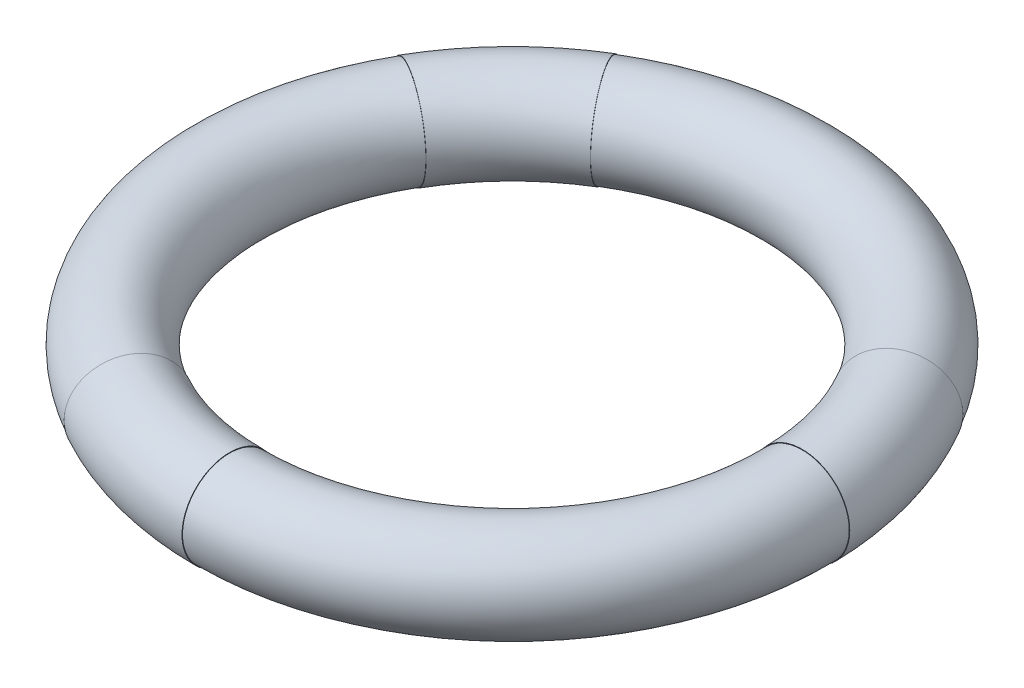
ISO-10303-21;
HEADER;
FILE_DESCRIPTION(('STEP AP214'),'2;1');
FILE_NAME('part.step','',(''),(''),'','','');
FILE_SCHEMA(('AUTOMOTIVE_DESIGN { 1 0 10303 214 1 1 1 1 }'));
ENDSEC;
DATA;
#1=APPLICATION_CONTEXT('core data for automotive mechanical design processes');
#2=APPLICATION_PROTOCOL_DEFINITION('international standard','automotive_design',2000,#1);
#3=PRODUCT_CONTEXT('',#1,'mechanical');
#4=PRODUCT('Part','Part','',(#3));
#5=PRODUCT_RELATED_PRODUCT_CATEGORY('part','',(#4));
#6=PRODUCT_DEFINITION_FORMATION('','',#4);
#7=PRODUCT_DEFINITION_CONTEXT('part definition',#1,'design');
#8=PRODUCT_DEFINITION('design','',#6,#7);
#9=PRODUCT_DEFINITION_SHAPE('','',#8);
#10=(LENGTH_UNIT() NAMED_UNIT(*) SI_UNIT(.MILLI.,.METRE.));
#11=(NAMED_UNIT(*) PLANE_ANGLE_UNIT() SI_UNIT($,.RADIAN.));
#12=(NAMED_UNIT(*) SI_UNIT($,.STERADIAN.) SOLID_ANGLE_UNIT());
#13=UNCERTAINTY_MEASURE_WITH_UNIT(LENGTH_MEASURE(1.E-05),#10,'distance_accuracy_value','');
#14=(GEOMETRIC_REPRESENTATION_CONTEXT(3) GLOBAL_UNCERTAINTY_ASSIGNED_CONTEXT((#13)) GLOBAL_UNIT_ASSIGNED_CONTEXT((#10,
#11,#12)) REPRESENTATION_CONTEXT('',''));
#15=CARTESIAN_POINT('',(0.,0.,0.));
#16=DIRECTION('',(0.,0.,1.));
#17=DIRECTION('',(1.,0.,0.));
#18=AXIS2_PLACEMENT_3D('',#15,#16,#17);
#19=CARTESIAN_POINT('',(0.,0.,0.));
#20=DIRECTION('',(0.,-1.,0.));
#21=DIRECTION('',(0.,0.,-1.));
#22=AXIS2_PLACEMENT_3D('',#19,#20,#21);
#23=TOROIDAL_SURFACE('',#22,152.4,25.4);
#24=CARTESIAN_POINT('',(152.357566020971,0.,-3.59611959833303));
#25=DIRECTION('',(-0.0235965852908991,0.,-0.999721561817394));
#26=DIRECTION('',(-0.999721561817394,0.,0.0235965852908991));
#27=AXIS2_PLACEMENT_3D('',#24,#25,#26);
#28=CIRCLE('',#27,25.4);
#29=CARTESIAN_POINT('',(177.750493691133,0.,-4.19547286472187));
#30=VERTEX_POINT('',#29);
#31=EDGE_CURVE('E10',#30,#30,#28,.T.);
#32=CARTESIAN_POINT('',(0.,0.,152.4));
#33=DIRECTION('',(1.,0.,0.));
#34=DIRECTION('',(0.,0.,-1.));
#35=AXIS2_PLACEMENT_3D('',#32,#33,#34);
#36=CIRCLE('',#35,25.4);
#37=CARTESIAN_POINT('',(0.,0.,177.8));
#38=VERTEX_POINT('',#37);
#39=EDGE_CURVE('E73',#38,#38,#36,.T.);
#40=CARTESIAN_POINT('',(0.,0.,0.));
#41=DIRECTION('',(0.,-1.,0.));
#42=DIRECTION('',(0.,0.,-1.));
#43=AXIS2_PLACEMENT_3D('',#40,#41,#42);
#44=CIRCLE('',#43,177.8);
#45=EDGE_CURVE('',#30,#38,#44,.T.);
#46=ORIENTED_EDGE('',*,*,#31,.F.);
#47=ORIENTED_EDGE('',*,*,#39,.T.);
#48=ORIENTED_EDGE('',*,*,#45,.T.);
#49=ORIENTED_EDGE('',*,*,#45,.F.);
#50=EDGE_LOOP('',(#46,#48,#47,#49));
#51=FACE_BOUND('',#50,.T.);
#52=ADVANCED_FACE('F45',(#51),#23,.T.);
#53=CARTESIAN_POINT('',(-79.2931139376895,0.,-130.147462833759));
#54=DIRECTION('',(-0.853985976599466,0.,0.520296023213186));
#55=DIRECTION('',(0.520296023213186,0.,0.853985976599466));
#56=AXIS2_PLACEMENT_3D('',#53,#54,#55);
#57=CIRCLE('',#56,25.4);
#58=CARTESIAN_POINT('',(-92.5086329273044,0.,-151.838706639385));
#59=VERTEX_POINT('',#58);
#60=EDGE_CURVE('E53',#59,#59,#57,.T.);
#61=CARTESIAN_POINT('',(131.982271536749,0.,-76.1999999999988));
#62=DIRECTION('',(-0.499999999999992,0.,-0.866025403784443));
#63=DIRECTION('',(-0.866025403784443,0.,0.499999999999992));
#64=AXIS2_PLACEMENT_3D('',#61,#62,#63);
#65=CIRCLE('',#64,25.4);
#66=CARTESIAN_POINT('',(153.979316792874,0.,-88.8999999999986));
#67=VERTEX_POINT('',#66);
#68=EDGE_CURVE('E97',#67,#67,#65,.T.);
#69=CARTESIAN_POINT('',(0.,0.,0.));
#70=DIRECTION('',(0.,-1.,0.));
#71=DIRECTION('',(0.,0.,-1.));
#72=AXIS2_PLACEMENT_3D('',#69,#70,#71);
#73=CIRCLE('',#72,177.8);
#74=EDGE_CURVE('',#59,#67,#73,.T.);
#75=ORIENTED_EDGE('',*,*,#60,.F.);
#76=ORIENTED_EDGE('',*,*,#68,.T.);
#77=ORIENTED_EDGE('',*,*,#74,.T.);
#78=ORIENTED_EDGE('',*,*,#74,.F.);
#79=EDGE_LOOP('',(#75,#77,#76,#78));
#80=FACE_BOUND('',#79,.T.);
#81=ADVANCED_FACE('F102',(#80),#23,.T.);
#82=CARTESIAN_POINT('',(0.,0.,0.));
#83=DIRECTION('',(0.,1.,0.));
#84=DIRECTION('',(0.,0.,1.));
#85=AXIS2_PLACEMENT_3D('',#82,#83,#84);
#86=TOROIDAL_SURFACE('',#85,152.4,25.6794);
#87=CARTESIAN_POINT('',(-73.0644520832807,0.,133.743582432093));
#88=DIRECTION('',(0.877582561890372,0.,0.479425538604204));
#89=DIRECTION('',(0.479425538604204,0.,-0.877582561890372));
#90=AXIS2_PLACEMENT_3D('',#87,#88,#89);
#91=CIRCLE('',#90,25.6794);
#92=CARTESIAN_POINT('',(-85.3758122593135,0.,156.2793760719));
#93=VERTEX_POINT('',#92);
#94=EDGE_CURVE('E63',#93,#93,#91,.T.);
#95=CARTESIAN_POINT('',(0.,0.,152.4));
#96=DIRECTION('',(1.,0.,0.));
#97=DIRECTION('',(0.,0.,-1.));
#98=AXIS2_PLACEMENT_3D('',#95,#96,#97);
#99=CIRCLE('',#98,25.6794);
#100=CARTESIAN_POINT('',(0.,0.,178.0794));
#101=VERTEX_POINT('',#100);
#102=EDGE_CURVE('E69',#101,#101,#99,.T.);
#103=CARTESIAN_POINT('',(0.,0.,0.));
#104=DIRECTION('',(0.,1.,0.));
#105=DIRECTION('',(0.,0.,1.));
#106=AXIS2_PLACEMENT_3D('',#103,#104,#105);
#107=CIRCLE('',#106,178.0794);
#108=EDGE_CURVE('',#93,#101,#107,.T.);
#109=ORIENTED_EDGE('',*,*,#94,.T.);
#110=ORIENTED_EDGE('',*,*,#102,.F.);
#111=ORIENTED_EDGE('',*,*,#108,.T.);
#112=ORIENTED_EDGE('',*,*,#108,.F.);
#113=EDGE_LOOP('',(#109,#111,#110,#112));
#114=FACE_BOUND('',#113,.T.);
#115=ADVANCED_FACE('F130',(#114),#86,.T.);
#116=CARTESIAN_POINT('',(-73.0644520832807,0.,133.743582432093));
#117=DIRECTION('',(0.877582561890372,0.,0.479425538604204));
#118=DIRECTION('',(0.479425538604204,0.,-0.877582561890372));
#119=AXIS2_PLACEMENT_3D('',#116,#117,#118);
#120=PLANE('',#119);
#121=CARTESIAN_POINT('',(-73.0644520832807,0.,133.743582432093));
#122=DIRECTION('',(0.877582561890372,0.,0.479425538604204));
#123=DIRECTION('',(0.479425538604204,0.,-0.877582561890372));
#124=AXIS2_PLACEMENT_3D('',#121,#122,#123);
#125=CIRCLE('',#124,25.4);
#126=CARTESIAN_POINT('',(-85.2418607638275,0.,156.034179504108));
#127=VERTEX_POINT('',#126);
#128=EDGE_CURVE('E58',#127,#127,#125,.T.);
#129=ORIENTED_EDGE('',*,*,#128,.T.);
#130=EDGE_LOOP('',(#129));
#131=FACE_BOUND('',#130,.T.);
#132=ORIENTED_EDGE('',*,*,#94,.F.);
#133=EDGE_LOOP('',(#132));
#134=FACE_BOUND('',#133,.T.);
#135=ADVANCED_FACE('F142',(#131,#134),#120,.F.);
#136=CARTESIAN_POINT('',(0.,0.,152.4));
#137=DIRECTION('',(1.,0.,0.));
#138=DIRECTION('',(0.,0.,-1.));
#139=AXIS2_PLACEMENT_3D('',#136,#137,#138);
#140=PLANE('',#139);
#141=ORIENTED_EDGE('',*,*,#39,.F.);
#142=EDGE_LOOP('',(#141));
#143=FACE_BOUND('',#142,.T.);
#144=ORIENTED_EDGE('',*,*,#102,.T.);
#145=EDGE_LOOP('',(#144));
#146=FACE_BOUND('',#145,.T.);
#147=ADVANCED_FACE('F134',(#143,#146),#140,.T.);
#148=CARTESIAN_POINT('',(-131.982271536748,0.,-76.2000000000006));
#149=DIRECTION('',(-0.500000000000004,0.,0.866025403784436));
#150=DIRECTION('',(0.866025403784436,0.,0.500000000000004));
#151=AXIS2_PLACEMENT_3D('',#148,#149,#150);
#152=CIRCLE('',#151,25.4);
#153=CARTESIAN_POINT('',(-153.979316792873,0.,-88.9000000000007));
#154=VERTEX_POINT('',#153);
#155=EDGE_CURVE('E85',#154,#154,#152,.T.);
#156=CARTESIAN_POINT('',(0.,0.,0.));
#157=DIRECTION('',(0.,-1.,0.));
#158=DIRECTION('',(0.,0.,-1.));
#159=AXIS2_PLACEMENT_3D('',#156,#157,#158);
#160=CIRCLE('',#159,177.8);
#161=EDGE_CURVE('',#127,#154,#160,.T.);
#162=ORIENTED_EDGE('',*,*,#128,.F.);
#163=ORIENTED_EDGE('',*,*,#155,.T.);
#164=ORIENTED_EDGE('',*,*,#161,.T.);
#165=ORIENTED_EDGE('',*,*,#161,.F.);
#166=EDGE_LOOP('',(#162,#164,#163,#165));
#167=FACE_BOUND('',#166,.T.);
#168=ADVANCED_FACE('F47',(#167),#23,.T.);
#169=CARTESIAN_POINT('',(0.,0.,0.));
#170=DIRECTION('',(0.,1.,0.));
#171=DIRECTION('',(-0.866025403784436,0.,-0.500000000000004));
#172=AXIS2_PLACEMENT_3D('',#169,#170,#171);
#173=TOROIDAL_SURFACE('',#172,152.4,25.6794);
#174=CARTESIAN_POINT('',(-79.2931139376895,0.,-130.147462833759));
#175=DIRECTION('',(-0.853985976599466,0.,0.520296023213186));
#176=DIRECTION('',(0.520296023213186,0.,0.853985976599466));
#177=AXIS2_PLACEMENT_3D('',#174,#175,#176);
#178=CIRCLE('',#177,25.6794);
#179=CARTESIAN_POINT('',(-92.6540036361902,0.,-152.077310321247));
#180=VERTEX_POINT('',#179);
#181=EDGE_CURVE('E77',#180,#180,#178,.T.);
#182=CARTESIAN_POINT('',(-131.982271536748,0.,-76.2000000000006));
#183=DIRECTION('',(-0.500000000000004,0.,0.866025403784436));
#184=DIRECTION('',(0.866025403784436,0.,0.500000000000004));
#185=AXIS2_PLACEMENT_3D('',#182,#183,#184);
#186=CIRCLE('',#185,25.6794);
#187=CARTESIAN_POINT('',(-154.22128429069,0.,-89.0397000000007));
#188=VERTEX_POINT('',#187);
#189=EDGE_CURVE('E81',#188,#188,#186,.T.);
#190=CARTESIAN_POINT('',(0.,0.,0.));
#191=DIRECTION('',(0.,1.,0.));
#192=DIRECTION('',(-0.866025403784436,0.,-0.500000000000004));
#193=AXIS2_PLACEMENT_3D('',#190,#191,#192);
#194=CIRCLE('',#193,178.0794);
#195=EDGE_CURVE('',#180,#188,#194,.T.);
#196=ORIENTED_EDGE('',*,*,#181,.T.);
#197=ORIENTED_EDGE('',*,*,#189,.F.);
#198=ORIENTED_EDGE('',*,*,#195,.T.);
#199=ORIENTED_EDGE('',*,*,#195,.F.);
#200=EDGE_LOOP('',(#196,#198,#197,#199));
#201=FACE_BOUND('',#200,.T.);
#202=ADVANCED_FACE('F133',(#201),#173,.T.);
#203=CARTESIAN_POINT('',(-79.2931139376895,0.,-130.147462833759));
#204=DIRECTION('',(-0.853985976599466,0.,0.520296023213186));
#205=DIRECTION('',(0.520296023213186,0.,0.853985976599466));
#206=AXIS2_PLACEMENT_3D('',#203,#204,#205);
#207=PLANE('',#206);
#208=ORIENTED_EDGE('',*,*,#60,.T.);
#209=EDGE_LOOP('',(#208));
#210=FACE_BOUND('',#209,.T.);
#211=ORIENTED_EDGE('',*,*,#181,.F.);
#212=EDGE_LOOP('',(#211));
#213=FACE_BOUND('',#212,.T.);
#214=ADVANCED_FACE('F122',(#210,#213),#207,.F.);
#215=CARTESIAN_POINT('',(-131.982271536748,0.,-76.2000000000006));
#216=DIRECTION('',(-0.500000000000004,0.,0.866025403784436));
#217=DIRECTION('',(0.866025403784436,0.,0.500000000000004));
#218=AXIS2_PLACEMENT_3D('',#215,#216,#217);
#219=PLANE('',#218);
#220=ORIENTED_EDGE('',*,*,#155,.F.);
#221=EDGE_LOOP('',(#220));
#222=FACE_BOUND('',#221,.T.);
#223=ORIENTED_EDGE('',*,*,#189,.T.);
#224=EDGE_LOOP('',(#223));
#225=FACE_BOUND('',#224,.T.);
#226=ADVANCED_FACE('F114',(#222,#225),#219,.T.);
#227=CARTESIAN_POINT('',(0.,0.,0.));
#228=DIRECTION('',(0.,1.,0.));
#229=DIRECTION('',(0.866025403784443,0.,-0.499999999999992));
#230=AXIS2_PLACEMENT_3D('',#227,#228,#229);
#231=TOROIDAL_SURFACE('',#230,152.4,25.6794);
#232=CARTESIAN_POINT('',(152.357566020971,0.,-3.59611959833302));
#233=DIRECTION('',(-0.0235965852908991,0.,-0.999721561817394));
#234=DIRECTION('',(-0.999721561817394,0.,0.0235965852908991));
#235=AXIS2_PLACEMENT_3D('',#232,#233,#234);
#236=CIRCLE('',#235,25.6794);
#237=CARTESIAN_POINT('',(178.029815895504,0.,-4.20206575065213));
#238=VERTEX_POINT('',#237);
#239=EDGE_CURVE('E89',#238,#238,#236,.T.);
#240=CARTESIAN_POINT('',(131.982271536749,0.,-76.1999999999988));
#241=DIRECTION('',(-0.499999999999992,0.,-0.866025403784443));
#242=DIRECTION('',(-0.866025403784443,0.,0.499999999999992));
#243=AXIS2_PLACEMENT_3D('',#240,#241,#242);
#244=CIRCLE('',#243,25.6794);
#245=CARTESIAN_POINT('',(154.221284290691,0.,-89.0396999999986));
#246=VERTEX_POINT('',#245);
#247=EDGE_CURVE('E93',#246,#246,#244,.T.);
#248=CARTESIAN_POINT('',(0.,0.,0.));
#249=DIRECTION('',(0.,1.,0.));
#250=DIRECTION('',(0.866025403784443,0.,-0.499999999999992));
#251=AXIS2_PLACEMENT_3D('',#248,#249,#250);
#252=CIRCLE('',#251,178.0794);
#253=EDGE_CURVE('',#238,#246,#252,.T.);
#254=ORIENTED_EDGE('',*,*,#239,.T.);
#255=ORIENTED_EDGE('',*,*,#247,.F.);
#256=ORIENTED_EDGE('',*,*,#253,.T.);
#257=ORIENTED_EDGE('',*,*,#253,.F.);
#258=EDGE_LOOP('',(#254,#256,#255,#257));
#259=FACE_BOUND('',#258,.T.);
#260=ADVANCED_FACE('F112',(#259),#231,.T.);
#261=CARTESIAN_POINT('',(152.357566020971,0.,-3.59611959833302));
#262=DIRECTION('',(-0.0235965852908991,0.,-0.999721561817394));
#263=DIRECTION('',(-0.999721561817394,0.,0.0235965852908991));
#264=AXIS2_PLACEMENT_3D('',#261,#262,#263);
#265=PLANE('',#264);
#266=ORIENTED_EDGE('',*,*,#31,.T.);
#267=EDGE_LOOP('',(#266));
#268=FACE_BOUND('',#267,.T.);
#269=ORIENTED_EDGE('',*,*,#239,.F.);
#270=EDGE_LOOP('',(#269));
#271=FACE_BOUND('',#270,.T.);
#272=ADVANCED_FACE('F108',(#268,#271),#265,.F.);
#273=CARTESIAN_POINT('',(131.982271536749,0.,-76.1999999999988));
#274=DIRECTION('',(-0.499999999999992,0.,-0.866025403784443));
#275=DIRECTION('',(-0.866025403784443,0.,0.499999999999992));
#276=AXIS2_PLACEMENT_3D('',#273,#274,#275);
#277=PLANE('',#276);
#278=ORIENTED_EDGE('',*,*,#68,.F.);
#279=EDGE_LOOP('',(#278));
#280=FACE_BOUND('',#279,.T.);
#281=ORIENTED_EDGE('',*,*,#247,.T.);
#282=EDGE_LOOP('',(#281));
#283=FACE_BOUND('',#282,.T.);
#284=ADVANCED_FACE('F105',(#280,#283),#277,.T.);
#285=CLOSED_SHELL('',(#52,#81,#115,#135,#147,#168,#202,#214,#226,#260,#272,#284));
#286=MANIFOLD_SOLID_BREP('B2',#285);
#287=ADVANCED_BREP_SHAPE_REPRESENTATION('',(#18,#286),#14);
#288=SHAPE_DEFINITION_REPRESENTATION(#9,#287);
ENDSEC;
END-ISO-10303-21;
